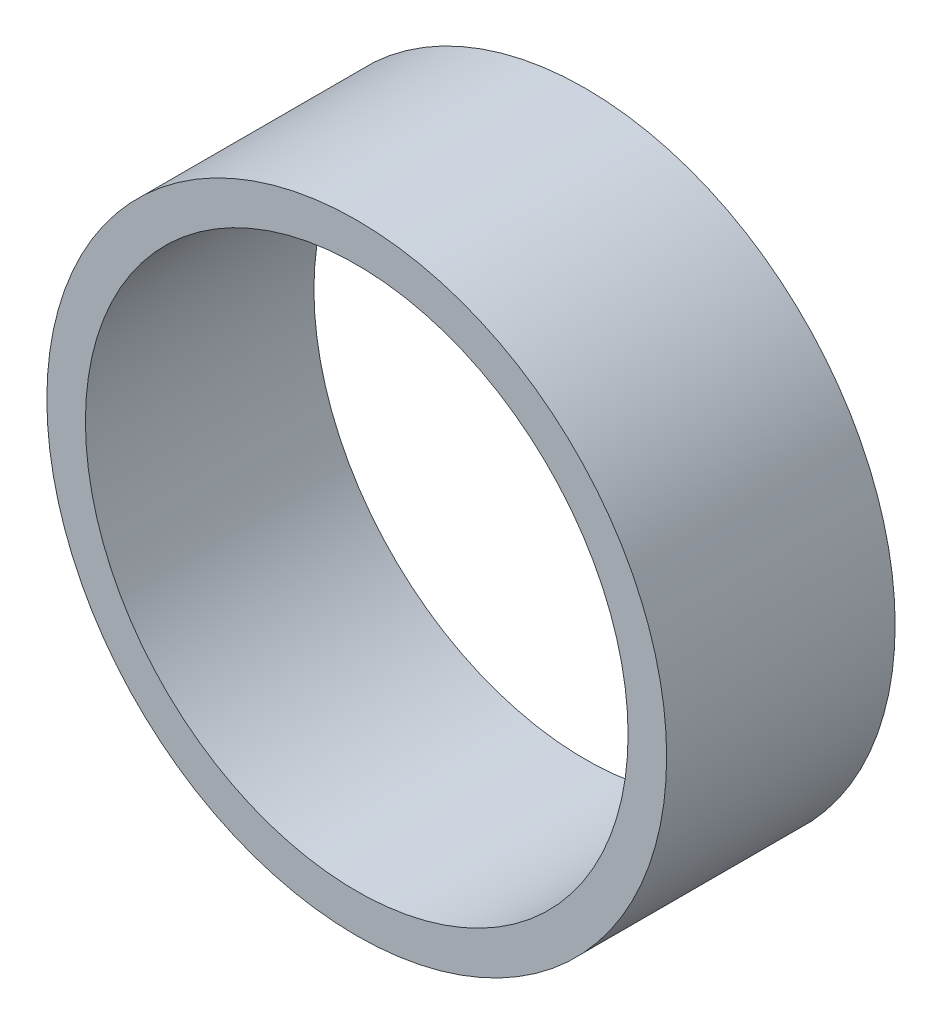
ISO-10303-21;
HEADER;
FILE_DESCRIPTION(('STEP AP214'),'2;1');
FILE_NAME('part.step','',(''),(''),'','','');
FILE_SCHEMA(('AUTOMOTIVE_DESIGN { 1 0 10303 214 1 1 1 1 }'));
ENDSEC;
DATA;
#1=APPLICATION_CONTEXT('core data for automotive mechanical design processes');
#2=APPLICATION_PROTOCOL_DEFINITION('international standard','automotive_design',2000,#1);
#3=PRODUCT_CONTEXT('',#1,'mechanical');
#4=PRODUCT('Part','Part','',(#3));
#5=PRODUCT_RELATED_PRODUCT_CATEGORY('part','',(#4));
#6=PRODUCT_DEFINITION_FORMATION('','',#4);
#7=PRODUCT_DEFINITION_CONTEXT('part definition',#1,'design');
#8=PRODUCT_DEFINITION('design','',#6,#7);
#9=PRODUCT_DEFINITION_SHAPE('','',#8);
#10=(LENGTH_UNIT() NAMED_UNIT(*) SI_UNIT(.MILLI.,.METRE.));
#11=(NAMED_UNIT(*) PLANE_ANGLE_UNIT() SI_UNIT($,.RADIAN.));
#12=(NAMED_UNIT(*) SI_UNIT($,.STERADIAN.) SOLID_ANGLE_UNIT());
#13=UNCERTAINTY_MEASURE_WITH_UNIT(LENGTH_MEASURE(1.E-05),#10,'distance_accuracy_value','');
#14=(GEOMETRIC_REPRESENTATION_CONTEXT(3) GLOBAL_UNCERTAINTY_ASSIGNED_CONTEXT((#13)) GLOBAL_UNIT_ASSIGNED_CONTEXT((#10,
#11,#12)) REPRESENTATION_CONTEXT('',''));
#15=CARTESIAN_POINT('',(0.,0.,0.));
#16=DIRECTION('',(0.,0.,1.));
#17=DIRECTION('',(1.,0.,0.));
#18=AXIS2_PLACEMENT_3D('',#15,#16,#17);
#19=CARTESIAN_POINT('',(0.,0.,4.));
#20=DIRECTION('',(0.,0.,1.));
#21=DIRECTION('',(1.,0.,0.));
#22=AXIS2_PLACEMENT_3D('',#19,#20,#21);
#23=PLANE('',#22);
#24=CARTESIAN_POINT('',(0.,0.,4.));
#25=DIRECTION('',(0.,0.,1.));
#26=DIRECTION('',(1.,0.,0.));
#27=AXIS2_PLACEMENT_3D('',#24,#25,#26);
#28=CIRCLE('',#27,5.425);
#29=CARTESIAN_POINT('',(5.425,0.,4.));
#30=VERTEX_POINT('',#29);
#31=EDGE_CURVE('E10',#30,#30,#28,.T.);
#32=ORIENTED_EDGE('',*,*,#31,.T.);
#33=EDGE_LOOP('',(#32));
#34=FACE_BOUND('',#33,.T.);
#35=CARTESIAN_POINT('',(0.,0.,4.));
#36=DIRECTION('',(0.,0.,1.));
#37=DIRECTION('',(1.,0.,0.));
#38=AXIS2_PLACEMENT_3D('',#35,#36,#37);
#39=CIRCLE('',#38,4.75);
#40=CARTESIAN_POINT('',(4.75,0.,4.));
#41=VERTEX_POINT('',#40);
#42=EDGE_CURVE('E50',#41,#41,#39,.T.);
#43=ORIENTED_EDGE('',*,*,#42,.F.);
#44=EDGE_LOOP('',(#43));
#45=FACE_BOUND('',#44,.T.);
#46=ADVANCED_FACE('F39',(#34,#45),#23,.T.);
#47=CARTESIAN_POINT('',(0.,0.,0.));
#48=DIRECTION('',(0.,0.,1.));
#49=DIRECTION('',(1.,0.,0.));
#50=AXIS2_PLACEMENT_3D('',#47,#48,#49);
#51=PLANE('',#50);
#52=CARTESIAN_POINT('',(0.,0.,0.));
#53=DIRECTION('',(0.,0.,1.));
#54=DIRECTION('',(1.,0.,0.));
#55=AXIS2_PLACEMENT_3D('',#52,#53,#54);
#56=CIRCLE('',#55,5.425);
#57=CARTESIAN_POINT('',(5.425,0.,0.));
#58=VERTEX_POINT('',#57);
#59=EDGE_CURVE('E43',#58,#58,#56,.T.);
#60=ORIENTED_EDGE('',*,*,#59,.F.);
#61=EDGE_LOOP('',(#60));
#62=FACE_BOUND('',#61,.T.);
#63=CARTESIAN_POINT('',(0.,0.,0.));
#64=DIRECTION('',(0.,0.,1.));
#65=DIRECTION('',(1.,0.,0.));
#66=AXIS2_PLACEMENT_3D('',#63,#64,#65);
#67=CIRCLE('',#66,4.75);
#68=CARTESIAN_POINT('',(4.75,0.,0.));
#69=VERTEX_POINT('',#68);
#70=EDGE_CURVE('E52',#69,#69,#67,.T.);
#71=ORIENTED_EDGE('',*,*,#70,.T.);
#72=EDGE_LOOP('',(#71));
#73=FACE_BOUND('',#72,.T.);
#74=ADVANCED_FACE('F62',(#62,#73),#51,.F.);
#75=CARTESIAN_POINT('',(0.,0.,4.));
#76=DIRECTION('',(0.,0.,-1.));
#77=DIRECTION('',(-1.,0.,0.));
#78=AXIS2_PLACEMENT_3D('',#75,#76,#77);
#79=CYLINDRICAL_SURFACE('',#78,5.425);
#80=ORIENTED_EDGE('',*,*,#31,.F.);
#81=EDGE_LOOP('',(#80));
#82=FACE_BOUND('',#81,.T.);
#83=ORIENTED_EDGE('',*,*,#59,.T.);
#84=EDGE_LOOP('',(#83));
#85=FACE_BOUND('',#84,.T.);
#86=ADVANCED_FACE('F41',(#82,#85),#79,.T.);
#87=CARTESIAN_POINT('',(0.,0.,4.));
#88=DIRECTION('',(0.,0.,-1.));
#89=DIRECTION('',(-1.,0.,0.));
#90=AXIS2_PLACEMENT_3D('',#87,#88,#89);
#91=CYLINDRICAL_SURFACE('',#90,4.75);
#92=ORIENTED_EDGE('',*,*,#42,.T.);
#93=EDGE_LOOP('',(#92));
#94=FACE_BOUND('',#93,.T.);
#95=ORIENTED_EDGE('',*,*,#70,.F.);
#96=EDGE_LOOP('',(#95));
#97=FACE_BOUND('',#96,.T.);
#98=ADVANCED_FACE('F58',(#94,#97),#91,.F.);
#99=CLOSED_SHELL('',(#46,#74,#86,#98));
#100=MANIFOLD_SOLID_BREP('B2',#99);
#101=ADVANCED_BREP_SHAPE_REPRESENTATION('',(#18,#100),#14);
#102=SHAPE_DEFINITION_REPRESENTATION(#9,#101);
ENDSEC;
END-ISO-10303-21;
